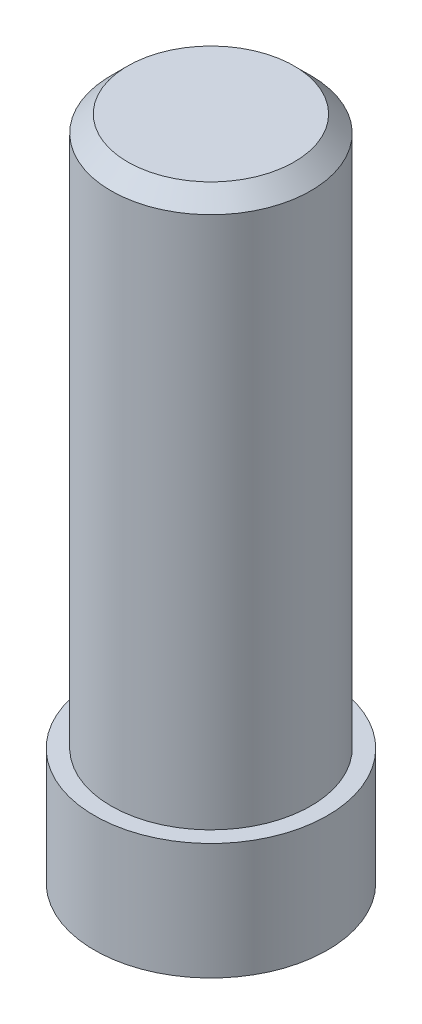
ISO-10303-21;
HEADER;
FILE_DESCRIPTION(('STEP AP214'),'2;1');
FILE_NAME('part.step','',(''),(''),'','','');
FILE_SCHEMA(('AUTOMOTIVE_DESIGN { 1 0 10303 214 1 1 1 1 }'));
ENDSEC;
DATA;
#1=APPLICATION_CONTEXT('core data for automotive mechanical design processes');
#2=APPLICATION_PROTOCOL_DEFINITION('international standard','automotive_design',2000,#1);
#3=PRODUCT_CONTEXT('',#1,'mechanical');
#4=PRODUCT('Part','Part','',(#3));
#5=PRODUCT_RELATED_PRODUCT_CATEGORY('part','',(#4));
#6=PRODUCT_DEFINITION_FORMATION('','',#4);
#7=PRODUCT_DEFINITION_CONTEXT('part definition',#1,'design');
#8=PRODUCT_DEFINITION('design','',#6,#7);
#9=PRODUCT_DEFINITION_SHAPE('','',#8);
#10=(LENGTH_UNIT() NAMED_UNIT(*) SI_UNIT(.MILLI.,.METRE.));
#11=(NAMED_UNIT(*) PLANE_ANGLE_UNIT() SI_UNIT($,.RADIAN.));
#12=(NAMED_UNIT(*) SI_UNIT($,.STERADIAN.) SOLID_ANGLE_UNIT());
#13=UNCERTAINTY_MEASURE_WITH_UNIT(LENGTH_MEASURE(1.E-05),#10,'distance_accuracy_value','');
#14=(GEOMETRIC_REPRESENTATION_CONTEXT(3) GLOBAL_UNCERTAINTY_ASSIGNED_CONTEXT((#13)) GLOBAL_UNIT_ASSIGNED_CONTEXT((#10,
#11,#12)) REPRESENTATION_CONTEXT('',''));
#15=CARTESIAN_POINT('',(0.,0.,0.));
#16=DIRECTION('',(0.,0.,1.));
#17=DIRECTION('',(1.,0.,0.));
#18=AXIS2_PLACEMENT_3D('',#15,#16,#17);
#19=CARTESIAN_POINT('',(0.,16.5,0.));
#20=DIRECTION('',(0.,-1.,0.));
#21=DIRECTION('',(0.,0.,-1.));
#22=AXIS2_PLACEMENT_3D('',#19,#20,#21);
#23=CYLINDRICAL_SURFACE('',#22,6.00000000000001);
#24=CARTESIAN_POINT('',(0.,15.5,0.));
#25=DIRECTION('',(0.,1.,0.));
#26=DIRECTION('',(0.,0.,1.));
#27=AXIS2_PLACEMENT_3D('',#24,#25,#26);
#28=CIRCLE('',#27,6.00000000000001);
#29=CARTESIAN_POINT('',(0.,15.5,6.00000000000001));
#30=VERTEX_POINT('',#29);
#31=EDGE_CURVE('E10',#30,#30,#28,.F.);
#32=ORIENTED_EDGE('',*,*,#31,.T.);
#33=EDGE_LOOP('',(#32));
#34=FACE_BOUND('',#33,.T.);
#35=CARTESIAN_POINT('',(0.,-16.5,0.));
#36=DIRECTION('',(0.,1.,0.));
#37=DIRECTION('',(0.,0.,1.));
#38=AXIS2_PLACEMENT_3D('',#35,#36,#37);
#39=CIRCLE('',#38,6.00000000000001);
#40=CARTESIAN_POINT('',(0.,-16.5,6.00000000000001));
#41=VERTEX_POINT('',#40);
#42=EDGE_CURVE('E59',#41,#41,#39,.T.);
#43=ORIENTED_EDGE('',*,*,#42,.T.);
#44=EDGE_LOOP('',(#43));
#45=FACE_BOUND('',#44,.T.);
#46=ADVANCED_FACE('F45',(#34,#45),#23,.T.);
#47=CARTESIAN_POINT('',(0.,16.5,0.));
#48=DIRECTION('',(0.,1.,0.));
#49=DIRECTION('',(0.,0.,1.));
#50=AXIS2_PLACEMENT_3D('',#47,#48,#49);
#51=PLANE('',#50);
#52=CARTESIAN_POINT('',(0.,16.5,0.));
#53=DIRECTION('',(0.,1.,0.));
#54=DIRECTION('',(0.,0.,1.));
#55=AXIS2_PLACEMENT_3D('',#52,#53,#54);
#56=CIRCLE('',#55,5.00000000000001);
#57=CARTESIAN_POINT('',(0.,16.5,5.00000000000001));
#58=VERTEX_POINT('',#57);
#59=EDGE_CURVE('E54',#58,#58,#56,.T.);
#60=ORIENTED_EDGE('',*,*,#59,.T.);
#61=EDGE_LOOP('',(#60));
#62=FACE_BOUND('',#61,.T.);
#63=ADVANCED_FACE('F80',(#62),#51,.T.);
#64=CARTESIAN_POINT('',(0.,-23.5,0.));
#65=DIRECTION('',(0.,1.,0.));
#66=DIRECTION('',(0.,0.,1.));
#67=AXIS2_PLACEMENT_3D('',#64,#65,#66);
#68=CYLINDRICAL_SURFACE('',#67,7.);
#69=CARTESIAN_POINT('',(0.,-23.5,0.));
#70=DIRECTION('',(0.,-1.,0.));
#71=DIRECTION('',(0.,0.,-1.));
#72=AXIS2_PLACEMENT_3D('',#69,#70,#71);
#73=CIRCLE('',#72,7.);
#74=CARTESIAN_POINT('',(0.,-23.5,-7.));
#75=VERTEX_POINT('',#74);
#76=EDGE_CURVE('E64',#75,#75,#73,.T.);
#77=ORIENTED_EDGE('',*,*,#76,.F.);
#78=EDGE_LOOP('',(#77));
#79=FACE_BOUND('',#78,.T.);
#80=CARTESIAN_POINT('',(0.,-16.5,0.));
#81=DIRECTION('',(0.,-1.,0.));
#82=DIRECTION('',(0.,0.,-1.));
#83=AXIS2_PLACEMENT_3D('',#80,#81,#82);
#84=CIRCLE('',#83,7.);
#85=CARTESIAN_POINT('',(0.,-16.5,-7.));
#86=VERTEX_POINT('',#85);
#87=EDGE_CURVE('E67',#86,#86,#84,.T.);
#88=ORIENTED_EDGE('',*,*,#87,.T.);
#89=EDGE_LOOP('',(#88));
#90=FACE_BOUND('',#89,.T.);
#91=ADVANCED_FACE('F77',(#79,#90),#68,.T.);
#92=CARTESIAN_POINT('',(0.,-23.5,0.));
#93=DIRECTION('',(0.,-1.,0.));
#94=DIRECTION('',(0.,0.,-1.));
#95=AXIS2_PLACEMENT_3D('',#92,#93,#94);
#96=PLANE('',#95);
#97=ORIENTED_EDGE('',*,*,#76,.T.);
#98=EDGE_LOOP('',(#97));
#99=FACE_BOUND('',#98,.T.);
#100=ADVANCED_FACE('F75',(#99),#96,.T.);
#101=CARTESIAN_POINT('',(0.,-16.5,0.));
#102=DIRECTION('',(0.,-1.,0.));
#103=DIRECTION('',(0.,0.,-1.));
#104=AXIS2_PLACEMENT_3D('',#101,#102,#103);
#105=PLANE('',#104);
#106=ORIENTED_EDGE('',*,*,#42,.F.);
#107=EDGE_LOOP('',(#106));
#108=FACE_BOUND('',#107,.T.);
#109=ORIENTED_EDGE('',*,*,#87,.F.);
#110=EDGE_LOOP('',(#109));
#111=FACE_BOUND('',#110,.T.);
#112=ADVANCED_FACE('F84',(#108,#111),#105,.F.);
#113=CARTESIAN_POINT('',(0.,16.5,0.));
#114=DIRECTION('',(0.,-1.,0.));
#115=DIRECTION('',(0.,0.,-1.));
#116=AXIS2_PLACEMENT_3D('',#113,#114,#115);
#117=CONICAL_SURFACE('',#116,5.00000000000001,0.785398163397445);
#118=ORIENTED_EDGE('',*,*,#31,.F.);
#119=EDGE_LOOP('',(#118));
#120=FACE_BOUND('',#119,.T.);
#121=ORIENTED_EDGE('',*,*,#59,.F.);
#122=EDGE_LOOP('',(#121));
#123=FACE_BOUND('',#122,.T.);
#124=ADVANCED_FACE('F48',(#120,#123),#117,.T.);
#125=CLOSED_SHELL('',(#46,#63,#91,#100,#112,#124));
#126=MANIFOLD_SOLID_BREP('B2',#125);
#127=ADVANCED_BREP_SHAPE_REPRESENTATION('',(#18,#126),#14);
#128=SHAPE_DEFINITION_REPRESENTATION(#9,#127);
ENDSEC;
END-ISO-10303-21;
